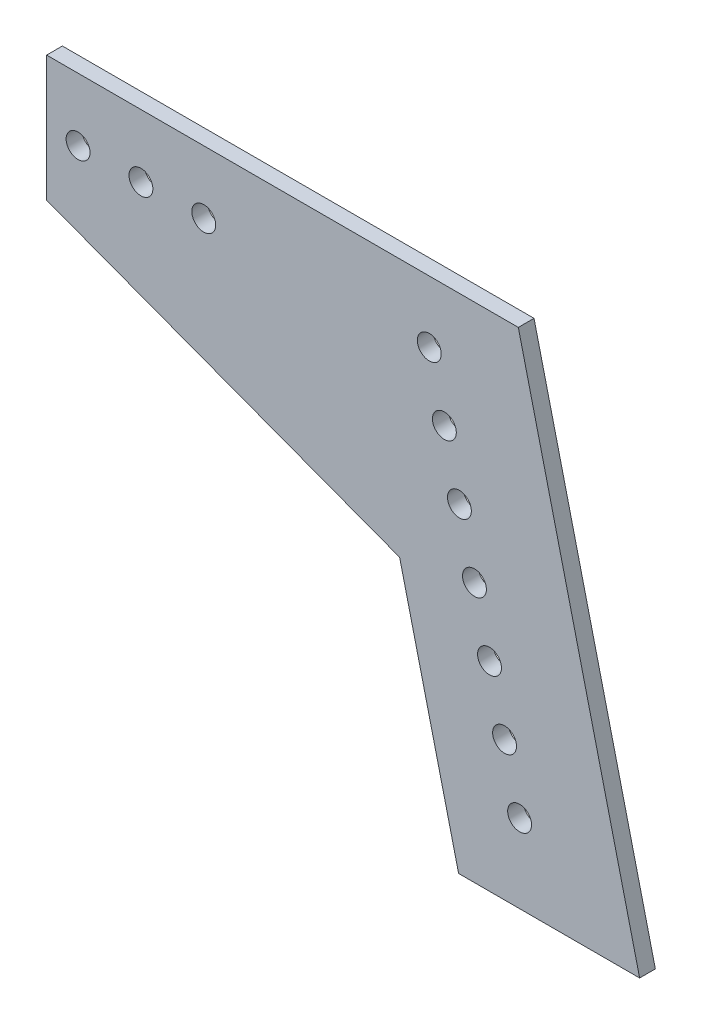
ISO-10303-21;
HEADER;
FILE_DESCRIPTION(('STEP AP214'),'2;1');
FILE_NAME('part.step','',(''),(''),'','','');
FILE_SCHEMA(('AUTOMOTIVE_DESIGN { 1 0 10303 214 1 1 1 1 }'));
ENDSEC;
DATA;
#1=APPLICATION_CONTEXT('core data for automotive mechanical design processes');
#2=APPLICATION_PROTOCOL_DEFINITION('international standard','automotive_design',2000,#1);
#3=PRODUCT_CONTEXT('',#1,'mechanical');
#4=PRODUCT('Part','Part','',(#3));
#5=PRODUCT_RELATED_PRODUCT_CATEGORY('part','',(#4));
#6=PRODUCT_DEFINITION_FORMATION('','',#4);
#7=PRODUCT_DEFINITION_CONTEXT('part definition',#1,'design');
#8=PRODUCT_DEFINITION('design','',#6,#7);
#9=PRODUCT_DEFINITION_SHAPE('','',#8);
#10=(LENGTH_UNIT() NAMED_UNIT(*) SI_UNIT(.MILLI.,.METRE.));
#11=(NAMED_UNIT(*) PLANE_ANGLE_UNIT() SI_UNIT($,.RADIAN.));
#12=(NAMED_UNIT(*) SI_UNIT($,.STERADIAN.) SOLID_ANGLE_UNIT());
#13=UNCERTAINTY_MEASURE_WITH_UNIT(LENGTH_MEASURE(1.E-05),#10,'distance_accuracy_value','');
#14=(GEOMETRIC_REPRESENTATION_CONTEXT(3) GLOBAL_UNCERTAINTY_ASSIGNED_CONTEXT((#13)) GLOBAL_UNIT_ASSIGNED_CONTEXT((#10,
#11,#12)) REPRESENTATION_CONTEXT('',''));
#15=CARTESIAN_POINT('',(0.,0.,0.));
#16=DIRECTION('',(0.,0.,1.));
#17=DIRECTION('',(1.,0.,0.));
#18=AXIS2_PLACEMENT_3D('',#15,#16,#17);
#19=CARTESIAN_POINT('',(-178.375641572512,-63.5,3.175));
#20=DIRECTION('',(0.,1.,0.));
#21=DIRECTION('',(-1.,0.,0.));
#22=AXIS2_PLACEMENT_3D('',#19,#20,#21);
#23=PLANE('',#22);
#24=DIRECTION('',(1.,0.,0.));
#25=VECTOR('',#24,1.);
#26=CARTESIAN_POINT('',(-178.375641572512,-63.5,3.175));
#27=LINE('',#26,#25);
#28=CARTESIAN_POINT('',(139.864527637599,-63.5,3.175));
#29=VERTEX_POINT('',#28);
#30=CARTESIAN_POINT('',(176.445152697022,-63.5,3.175));
#31=VERTEX_POINT('',#30);
#32=EDGE_CURVE('E204',#29,#31,#27,.T.);
#33=ORIENTED_EDGE('',*,*,#32,.F.);
#34=DIRECTION('',(0.,0.,-1.));
#35=VECTOR('',#34,1.);
#36=CARTESIAN_POINT('',(139.864527637599,-63.5,3.175));
#37=LINE('',#36,#35);
#38=CARTESIAN_POINT('',(139.864527637599,-63.5,0.));
#39=VERTEX_POINT('',#38);
#40=EDGE_CURVE('E197',#29,#39,#37,.T.);
#41=ORIENTED_EDGE('',*,*,#40,.T.);
#42=DIRECTION('',(1.,0.,0.));
#43=VECTOR('',#42,1.);
#44=CARTESIAN_POINT('',(-178.375641572512,-63.5,0.));
#45=LINE('',#44,#43);
#46=CARTESIAN_POINT('',(176.445152697022,-63.5,0.));
#47=VERTEX_POINT('',#46);
#48=EDGE_CURVE('E201',#39,#47,#45,.T.);
#49=ORIENTED_EDGE('',*,*,#48,.T.);
#50=DIRECTION('',(0.,0.,-1.));
#51=VECTOR('',#50,1.);
#52=CARTESIAN_POINT('',(176.445152697022,-63.5,3.175));
#53=LINE('',#52,#51);
#54=EDGE_CURVE('E207',#31,#47,#53,.T.);
#55=ORIENTED_EDGE('',*,*,#54,.F.);
#56=EDGE_LOOP('',(#33,#41,#49,#55));
#57=FACE_BOUND('',#56,.T.);
#58=ADVANCED_FACE('F38',(#57),#23,.F.);
#59=CARTESIAN_POINT('',(0.,0.,3.175));
#60=DIRECTION('',(0.,0.,-1.));
#61=DIRECTION('',(-1.,0.,0.));
#62=AXIS2_PLACEMENT_3D('',#59,#60,#61);
#63=PLANE('',#62);
#64=CARTESIAN_POINT('',(62.970358568024,25.3999999999997,3.175));
#65=DIRECTION('',(0.,0.,-1.));
#66=DIRECTION('',(-1.,0.,0.));
#67=AXIS2_PLACEMENT_3D('',#64,#65,#66);
#68=CIRCLE('',#67,2.413);
#69=CARTESIAN_POINT('',(60.557358568024,25.3999999999997,3.175));
#70=VERTEX_POINT('',#69);
#71=EDGE_CURVE('E123',#70,#70,#68,.T.);
#72=ORIENTED_EDGE('',*,*,#71,.T.);
#73=EDGE_LOOP('',(#72));
#74=FACE_BOUND('',#73,.T.);
#75=CARTESIAN_POINT('',(75.670358568024,25.3999999999997,3.175));
#76=DIRECTION('',(0.,0.,-1.));
#77=DIRECTION('',(-1.,0.,0.));
#78=AXIS2_PLACEMENT_3D('',#75,#76,#77);
#79=CIRCLE('',#78,2.413);
#80=CARTESIAN_POINT('',(73.257358568024,25.3999999999997,3.175));
#81=VERTEX_POINT('',#80);
#82=EDGE_CURVE('E265',#81,#81,#79,.T.);
#83=ORIENTED_EDGE('',*,*,#82,.T.);
#84=EDGE_LOOP('',(#83));
#85=FACE_BOUND('',#84,.T.);
#86=CARTESIAN_POINT('',(88.370358568024,25.3999999999997,3.175));
#87=DIRECTION('',(0.,0.,-1.));
#88=DIRECTION('',(-1.,0.,0.));
#89=AXIS2_PLACEMENT_3D('',#86,#87,#88);
#90=CIRCLE('',#89,2.413);
#91=CARTESIAN_POINT('',(85.957358568024,25.3999999999997,3.175));
#92=VERTEX_POINT('',#91);
#93=EDGE_CURVE('E259',#92,#92,#90,.T.);
#94=ORIENTED_EDGE('',*,*,#93,.T.);
#95=EDGE_LOOP('',(#94));
#96=FACE_BOUND('',#95,.T.);
#97=CARTESIAN_POINT('',(152.192493977256,-47.625,3.175));
#98=DIRECTION('',(0.,0.,-1.));
#99=DIRECTION('',(-1.,0.,0.));
#100=AXIS2_PLACEMENT_3D('',#97,#98,#99);
#101=CIRCLE('',#100,2.41299999999999);
#102=CARTESIAN_POINT('',(149.779493977256,-47.625,3.175));
#103=VERTEX_POINT('',#102);
#104=EDGE_CURVE('E136',#103,#103,#101,.T.);
#105=ORIENTED_EDGE('',*,*,#104,.T.);
#106=EDGE_LOOP('',(#105));
#107=FACE_BOUND('',#106,.T.);
#108=CARTESIAN_POINT('',(149.151314542085,-35.4142659866635,3.175));
#109=DIRECTION('',(0.,0.,-1.));
#110=DIRECTION('',(-1.,0.,0.));
#111=AXIS2_PLACEMENT_3D('',#108,#109,#110);
#112=CIRCLE('',#111,2.41299999999999);
#113=CARTESIAN_POINT('',(146.738314542085,-35.4142659866635,3.175));
#114=VERTEX_POINT('',#113);
#115=EDGE_CURVE('E145',#114,#114,#112,.T.);
#116=ORIENTED_EDGE('',*,*,#115,.T.);
#117=EDGE_LOOP('',(#116));
#118=FACE_BOUND('',#117,.T.);
#119=CARTESIAN_POINT('',(146.110135106914,-23.2035319733271,3.175));
#120=DIRECTION('',(0.,0.,-1.));
#121=DIRECTION('',(-1.,0.,0.));
#122=AXIS2_PLACEMENT_3D('',#119,#120,#121);
#123=CIRCLE('',#122,2.413);
#124=CARTESIAN_POINT('',(143.697135106914,-23.2035319733271,3.175));
#125=VERTEX_POINT('',#124);
#126=EDGE_CURVE('E153',#125,#125,#123,.T.);
#127=ORIENTED_EDGE('',*,*,#126,.T.);
#128=EDGE_LOOP('',(#127));
#129=FACE_BOUND('',#128,.T.);
#130=CARTESIAN_POINT('',(143.068955671742,-10.9927979599906,3.175));
#131=DIRECTION('',(0.,0.,-1.));
#132=DIRECTION('',(-1.,0.,0.));
#133=AXIS2_PLACEMENT_3D('',#130,#131,#132);
#134=CIRCLE('',#133,2.41299999999999);
#135=CARTESIAN_POINT('',(140.655955671742,-10.9927979599906,3.175));
#136=VERTEX_POINT('',#135);
#137=EDGE_CURVE('E161',#136,#136,#134,.T.);
#138=ORIENTED_EDGE('',*,*,#137,.T.);
#139=EDGE_LOOP('',(#138));
#140=FACE_BOUND('',#139,.T.);
#141=CARTESIAN_POINT('',(140.027776236571,1.2179360533458,3.175));
#142=DIRECTION('',(0.,0.,-1.));
#143=DIRECTION('',(-1.,0.,0.));
#144=AXIS2_PLACEMENT_3D('',#141,#142,#143);
#145=CIRCLE('',#144,2.413);
#146=CARTESIAN_POINT('',(137.614776236571,1.2179360533458,3.175));
#147=VERTEX_POINT('',#146);
#148=EDGE_CURVE('E169',#147,#147,#145,.T.);
#149=ORIENTED_EDGE('',*,*,#148,.T.);
#150=EDGE_LOOP('',(#149));
#151=FACE_BOUND('',#150,.T.);
#152=CARTESIAN_POINT('',(136.9865968014,13.4286700666822,3.175));
#153=DIRECTION('',(0.,0.,-1.));
#154=DIRECTION('',(-1.,0.,0.));
#155=AXIS2_PLACEMENT_3D('',#152,#153,#154);
#156=CIRCLE('',#155,2.41299999999999);
#157=CARTESIAN_POINT('',(134.5735968014,13.4286700666822,3.175));
#158=VERTEX_POINT('',#157);
#159=EDGE_CURVE('E177',#158,#158,#156,.T.);
#160=ORIENTED_EDGE('',*,*,#159,.T.);
#161=EDGE_LOOP('',(#160));
#162=FACE_BOUND('',#161,.T.);
#163=CARTESIAN_POINT('',(133.945417366229,25.6394040800187,3.175));
#164=DIRECTION('',(0.,0.,-1.));
#165=DIRECTION('',(-1.,0.,0.));
#166=AXIS2_PLACEMENT_3D('',#163,#164,#165);
#167=CIRCLE('',#166,2.413);
#168=CARTESIAN_POINT('',(131.532417366229,25.6394040800187,3.175));
#169=VERTEX_POINT('',#168);
#170=EDGE_CURVE('E185',#169,#169,#167,.T.);
#171=ORIENTED_EDGE('',*,*,#170,.T.);
#172=EDGE_LOOP('',(#171));
#173=FACE_BOUND('',#172,.T.);
#174=DIRECTION('',(0.,-1.,0.));
#175=VECTOR('',#174,1.);
#176=CARTESIAN_POINT('',(56.620358568024,12.7,3.175));
#177=LINE('',#176,#175);
#178=CARTESIAN_POINT('',(56.620358568024,38.1,3.175));
#179=VERTEX_POINT('',#178);
#180=CARTESIAN_POINT('',(56.620358568024,12.7,3.175));
#181=VERTEX_POINT('',#180);
#182=EDGE_CURVE('E54',#179,#181,#177,.T.);
#183=ORIENTED_EDGE('',*,*,#182,.T.);
#184=DIRECTION('',(0.936021054773888,-0.351944008359252,0.));
#185=VECTOR('',#184,1.);
#186=CARTESIAN_POINT('',(127.945162941794,-14.118133436975,3.175));
#187=LINE('',#186,#185);
#188=CARTESIAN_POINT('',(127.945162941794,-14.118133436975,3.175));
#189=VERTEX_POINT('',#188);
#190=EDGE_CURVE('E102',#181,#189,#187,.T.);
#191=ORIENTED_EDGE('',*,*,#190,.T.);
#192=DIRECTION('',(0.234633163303243,-0.972083987461121,0.));
#193=VECTOR('',#192,1.);
#194=CARTESIAN_POINT('',(139.864527637599,-63.5,3.175));
#195=LINE('',#194,#193);
#196=EDGE_CURVE('E192',#189,#29,#195,.T.);
#197=ORIENTED_EDGE('',*,*,#196,.T.);
#198=ORIENTED_EDGE('',*,*,#32,.T.);
#199=DIRECTION('',(-0.234569716009801,0.972099299624828,0.));
#200=VECTOR('',#199,1.);
#201=CARTESIAN_POINT('',(139.670694847201,88.9,3.175));
#202=LINE('',#201,#200);
#203=CARTESIAN_POINT('',(151.928847463808,38.1,3.175));
#204=VERTEX_POINT('',#203);
#205=EDGE_CURVE('E47',#31,#204,#202,.T.);
#206=ORIENTED_EDGE('',*,*,#205,.T.);
#207=DIRECTION('',(-1.,0.,0.));
#208=VECTOR('',#207,1.);
#209=CARTESIAN_POINT('',(151.928847463808,38.1,3.175));
#210=LINE('',#209,#208);
#211=EDGE_CURVE('E61',#204,#179,#210,.T.);
#212=ORIENTED_EDGE('',*,*,#211,.T.);
#213=EDGE_LOOP('',(#183,#191,#197,#198,#206,#212));
#214=FACE_BOUND('',#213,.T.);
#215=ADVANCED_FACE('F111',(#74,#85,#96,#107,#118,#129,#140,#151,#162,#173,#214),#63,.F.);
#216=CARTESIAN_POINT('',(0.,0.,0.));
#217=DIRECTION('',(0.,0.,-1.));
#218=DIRECTION('',(-1.,0.,0.));
#219=AXIS2_PLACEMENT_3D('',#216,#217,#218);
#220=PLANE('',#219);
#221=CARTESIAN_POINT('',(62.970358568024,25.3999999999997,0.));
#222=DIRECTION('',(0.,0.,-1.));
#223=DIRECTION('',(-1.,0.,0.));
#224=AXIS2_PLACEMENT_3D('',#221,#222,#223);
#225=CIRCLE('',#224,2.413);
#226=CARTESIAN_POINT('',(60.557358568024,25.3999999999997,0.));
#227=VERTEX_POINT('',#226);
#228=EDGE_CURVE('E250',#227,#227,#225,.T.);
#229=ORIENTED_EDGE('',*,*,#228,.F.);
#230=EDGE_LOOP('',(#229));
#231=FACE_BOUND('',#230,.T.);
#232=CARTESIAN_POINT('',(75.670358568024,25.3999999999997,0.));
#233=DIRECTION('',(0.,0.,-1.));
#234=DIRECTION('',(-1.,0.,0.));
#235=AXIS2_PLACEMENT_3D('',#232,#233,#234);
#236=CIRCLE('',#235,2.413);
#237=CARTESIAN_POINT('',(73.257358568024,25.3999999999997,0.));
#238=VERTEX_POINT('',#237);
#239=EDGE_CURVE('E254',#238,#238,#236,.T.);
#240=ORIENTED_EDGE('',*,*,#239,.F.);
#241=EDGE_LOOP('',(#240));
#242=FACE_BOUND('',#241,.T.);
#243=CARTESIAN_POINT('',(88.370358568024,25.3999999999997,0.));
#244=DIRECTION('',(0.,0.,-1.));
#245=DIRECTION('',(-1.,0.,0.));
#246=AXIS2_PLACEMENT_3D('',#243,#244,#245);
#247=CIRCLE('',#246,2.413);
#248=CARTESIAN_POINT('',(85.957358568024,25.3999999999997,0.));
#249=VERTEX_POINT('',#248);
#250=EDGE_CURVE('E119',#249,#249,#247,.T.);
#251=ORIENTED_EDGE('',*,*,#250,.F.);
#252=EDGE_LOOP('',(#251));
#253=FACE_BOUND('',#252,.T.);
#254=DIRECTION('',(0.936021054773888,-0.351944008359252,0.));
#255=VECTOR('',#254,1.);
#256=CARTESIAN_POINT('',(127.945162941794,-14.118133436975,0.));
#257=LINE('',#256,#255);
#258=CARTESIAN_POINT('',(56.620358568024,12.7,0.));
#259=VERTEX_POINT('',#258);
#260=CARTESIAN_POINT('',(127.945162941794,-14.118133436975,0.));
#261=VERTEX_POINT('',#260);
#262=EDGE_CURVE('E114',#259,#261,#257,.T.);
#263=ORIENTED_EDGE('',*,*,#262,.F.);
#264=DIRECTION('',(0.,-1.,0.));
#265=VECTOR('',#264,1.);
#266=CARTESIAN_POINT('',(56.620358568024,12.7,0.));
#267=LINE('',#266,#265);
#268=CARTESIAN_POINT('',(56.620358568024,38.1,0.));
#269=VERTEX_POINT('',#268);
#270=EDGE_CURVE('E94',#269,#259,#267,.T.);
#271=ORIENTED_EDGE('',*,*,#270,.F.);
#272=DIRECTION('',(-1.,0.,0.));
#273=VECTOR('',#272,1.);
#274=CARTESIAN_POINT('',(151.928847463808,38.1,0.));
#275=LINE('',#274,#273);
#276=CARTESIAN_POINT('',(151.928847463808,38.1,0.));
#277=VERTEX_POINT('',#276);
#278=EDGE_CURVE('E98',#277,#269,#275,.T.);
#279=ORIENTED_EDGE('',*,*,#278,.F.);
#280=DIRECTION('',(-0.234569716009801,0.972099299624828,0.));
#281=VECTOR('',#280,1.);
#282=CARTESIAN_POINT('',(152.257028490917,36.7399585077311,0.));
#283=LINE('',#282,#281);
#284=EDGE_CURVE('E11',#47,#277,#283,.T.);
#285=ORIENTED_EDGE('',*,*,#284,.F.);
#286=ORIENTED_EDGE('',*,*,#48,.F.);
#287=DIRECTION('',(0.234633163303243,-0.972083987461121,0.));
#288=VECTOR('',#287,1.);
#289=CARTESIAN_POINT('',(139.864527637599,-63.5,0.));
#290=LINE('',#289,#288);
#291=EDGE_CURVE('E140',#261,#39,#290,.T.);
#292=ORIENTED_EDGE('',*,*,#291,.F.);
#293=EDGE_LOOP('',(#263,#271,#279,#285,#286,#292));
#294=FACE_BOUND('',#293,.T.);
#295=CARTESIAN_POINT('',(152.192493977256,-47.625,0.));
#296=DIRECTION('',(0.,0.,-1.));
#297=DIRECTION('',(-1.,0.,0.));
#298=AXIS2_PLACEMENT_3D('',#295,#296,#297);
#299=CIRCLE('',#298,2.41299999999999);
#300=CARTESIAN_POINT('',(149.779493977256,-47.625,0.));
#301=VERTEX_POINT('',#300);
#302=EDGE_CURVE('E141',#301,#301,#299,.T.);
#303=ORIENTED_EDGE('',*,*,#302,.F.);
#304=EDGE_LOOP('',(#303));
#305=FACE_BOUND('',#304,.T.);
#306=CARTESIAN_POINT('',(149.151314542085,-35.4142659866635,0.));
#307=DIRECTION('',(0.,0.,-1.));
#308=DIRECTION('',(-1.,0.,0.));
#309=AXIS2_PLACEMENT_3D('',#306,#307,#308);
#310=CIRCLE('',#309,2.41299999999999);
#311=CARTESIAN_POINT('',(146.738314542085,-35.4142659866635,0.));
#312=VERTEX_POINT('',#311);
#313=EDGE_CURVE('E149',#312,#312,#310,.T.);
#314=ORIENTED_EDGE('',*,*,#313,.F.);
#315=EDGE_LOOP('',(#314));
#316=FACE_BOUND('',#315,.T.);
#317=CARTESIAN_POINT('',(146.110135106914,-23.2035319733271,0.));
#318=DIRECTION('',(0.,0.,-1.));
#319=DIRECTION('',(-1.,0.,0.));
#320=AXIS2_PLACEMENT_3D('',#317,#318,#319);
#321=CIRCLE('',#320,2.413);
#322=CARTESIAN_POINT('',(143.697135106914,-23.2035319733271,0.));
#323=VERTEX_POINT('',#322);
#324=EDGE_CURVE('E157',#323,#323,#321,.T.);
#325=ORIENTED_EDGE('',*,*,#324,.F.);
#326=EDGE_LOOP('',(#325));
#327=FACE_BOUND('',#326,.T.);
#328=CARTESIAN_POINT('',(143.068955671742,-10.9927979599906,0.));
#329=DIRECTION('',(0.,0.,-1.));
#330=DIRECTION('',(-1.,0.,0.));
#331=AXIS2_PLACEMENT_3D('',#328,#329,#330);
#332=CIRCLE('',#331,2.41299999999999);
#333=CARTESIAN_POINT('',(140.655955671742,-10.9927979599906,0.));
#334=VERTEX_POINT('',#333);
#335=EDGE_CURVE('E165',#334,#334,#332,.T.);
#336=ORIENTED_EDGE('',*,*,#335,.F.);
#337=EDGE_LOOP('',(#336));
#338=FACE_BOUND('',#337,.T.);
#339=CARTESIAN_POINT('',(140.027776236571,1.2179360533458,0.));
#340=DIRECTION('',(0.,0.,-1.));
#341=DIRECTION('',(-1.,0.,0.));
#342=AXIS2_PLACEMENT_3D('',#339,#340,#341);
#343=CIRCLE('',#342,2.413);
#344=CARTESIAN_POINT('',(137.614776236571,1.2179360533458,0.));
#345=VERTEX_POINT('',#344);
#346=EDGE_CURVE('E173',#345,#345,#343,.T.);
#347=ORIENTED_EDGE('',*,*,#346,.F.);
#348=EDGE_LOOP('',(#347));
#349=FACE_BOUND('',#348,.T.);
#350=CARTESIAN_POINT('',(136.9865968014,13.4286700666822,0.));
#351=DIRECTION('',(0.,0.,-1.));
#352=DIRECTION('',(-1.,0.,0.));
#353=AXIS2_PLACEMENT_3D('',#350,#351,#352);
#354=CIRCLE('',#353,2.41299999999999);
#355=CARTESIAN_POINT('',(134.5735968014,13.4286700666822,0.));
#356=VERTEX_POINT('',#355);
#357=EDGE_CURVE('E181',#356,#356,#354,.T.);
#358=ORIENTED_EDGE('',*,*,#357,.F.);
#359=EDGE_LOOP('',(#358));
#360=FACE_BOUND('',#359,.T.);
#361=CARTESIAN_POINT('',(133.945417366229,25.6394040800187,0.));
#362=DIRECTION('',(0.,0.,-1.));
#363=DIRECTION('',(-1.,0.,0.));
#364=AXIS2_PLACEMENT_3D('',#361,#362,#363);
#365=CIRCLE('',#364,2.413);
#366=CARTESIAN_POINT('',(131.532417366229,25.6394040800187,0.));
#367=VERTEX_POINT('',#366);
#368=EDGE_CURVE('E135',#367,#367,#365,.T.);
#369=ORIENTED_EDGE('',*,*,#368,.F.);
#370=EDGE_LOOP('',(#369));
#371=FACE_BOUND('',#370,.T.);
#372=ADVANCED_FACE('F40',(#231,#242,#253,#294,#305,#316,#327,#338,#349,#360,#371),#220,.T.);
#373=CARTESIAN_POINT('',(139.670694847201,88.9,3.175));
#374=DIRECTION('',(-0.972099299624828,-0.234569716009801,0.));
#375=DIRECTION('',(0.234569716009801,-0.972099299624828,0.));
#376=AXIS2_PLACEMENT_3D('',#373,#374,#375);
#377=PLANE('',#376);
#378=ORIENTED_EDGE('',*,*,#284,.T.);
#379=DIRECTION('',(0.,0.,-1.));
#380=VECTOR('',#379,1.);
#381=CARTESIAN_POINT('',(151.928847463808,38.1,3.175));
#382=LINE('',#381,#380);
#383=EDGE_CURVE('E129',#204,#277,#382,.T.);
#384=ORIENTED_EDGE('',*,*,#383,.F.);
#385=ORIENTED_EDGE('',*,*,#205,.F.);
#386=ORIENTED_EDGE('',*,*,#54,.T.);
#387=EDGE_LOOP('',(#378,#384,#385,#386));
#388=FACE_BOUND('',#387,.T.);
#389=ADVANCED_FACE('F217',(#388),#377,.F.);
#390=CARTESIAN_POINT('',(139.864527637599,-63.5,3.175));
#391=DIRECTION('',(0.972083987461121,0.234633163303243,0.));
#392=DIRECTION('',(-0.234633163303243,0.972083987461121,0.));
#393=AXIS2_PLACEMENT_3D('',#390,#391,#392);
#394=PLANE('',#393);
#395=ORIENTED_EDGE('',*,*,#291,.T.);
#396=ORIENTED_EDGE('',*,*,#40,.F.);
#397=ORIENTED_EDGE('',*,*,#196,.F.);
#398=DIRECTION('',(0.,0.,-1.));
#399=VECTOR('',#398,1.);
#400=CARTESIAN_POINT('',(127.945162941794,-14.118133436975,3.175));
#401=LINE('',#400,#399);
#402=EDGE_CURVE('E105',#189,#261,#401,.T.);
#403=ORIENTED_EDGE('',*,*,#402,.T.);
#404=EDGE_LOOP('',(#395,#396,#397,#403));
#405=FACE_BOUND('',#404,.T.);
#406=ADVANCED_FACE('F226',(#405),#394,.F.);
#407=CARTESIAN_POINT('',(133.945417366229,25.6394040800187,3.175));
#408=DIRECTION('',(0.,0.,-1.));
#409=DIRECTION('',(-1.,0.,0.));
#410=AXIS2_PLACEMENT_3D('',#407,#408,#409);
#411=CYLINDRICAL_SURFACE('',#410,2.413);
#412=ORIENTED_EDGE('',*,*,#170,.F.);
#413=EDGE_LOOP('',(#412));
#414=FACE_BOUND('',#413,.T.);
#415=ORIENTED_EDGE('',*,*,#368,.T.);
#416=EDGE_LOOP('',(#415));
#417=FACE_BOUND('',#416,.T.);
#418=ADVANCED_FACE('F242',(#414,#417),#411,.F.);
#419=CARTESIAN_POINT('',(136.9865968014,13.4286700666822,3.175));
#420=DIRECTION('',(0.,0.,-1.));
#421=DIRECTION('',(-1.,0.,0.));
#422=AXIS2_PLACEMENT_3D('',#419,#420,#421);
#423=CYLINDRICAL_SURFACE('',#422,2.41299999999999);
#424=ORIENTED_EDGE('',*,*,#159,.F.);
#425=EDGE_LOOP('',(#424));
#426=FACE_BOUND('',#425,.T.);
#427=ORIENTED_EDGE('',*,*,#357,.T.);
#428=EDGE_LOOP('',(#427));
#429=FACE_BOUND('',#428,.T.);
#430=ADVANCED_FACE('F318',(#426,#429),#423,.F.);
#431=CARTESIAN_POINT('',(140.027776236571,1.2179360533458,3.175));
#432=DIRECTION('',(0.,0.,-1.));
#433=DIRECTION('',(-1.,0.,0.));
#434=AXIS2_PLACEMENT_3D('',#431,#432,#433);
#435=CYLINDRICAL_SURFACE('',#434,2.413);
#436=ORIENTED_EDGE('',*,*,#148,.F.);
#437=EDGE_LOOP('',(#436));
#438=FACE_BOUND('',#437,.T.);
#439=ORIENTED_EDGE('',*,*,#346,.T.);
#440=EDGE_LOOP('',(#439));
#441=FACE_BOUND('',#440,.T.);
#442=ADVANCED_FACE('F314',(#438,#441),#435,.F.);
#443=CARTESIAN_POINT('',(143.068955671742,-10.9927979599906,3.175));
#444=DIRECTION('',(0.,0.,-1.));
#445=DIRECTION('',(-1.,0.,0.));
#446=AXIS2_PLACEMENT_3D('',#443,#444,#445);
#447=CYLINDRICAL_SURFACE('',#446,2.41299999999999);
#448=ORIENTED_EDGE('',*,*,#137,.F.);
#449=EDGE_LOOP('',(#448));
#450=FACE_BOUND('',#449,.T.);
#451=ORIENTED_EDGE('',*,*,#335,.T.);
#452=EDGE_LOOP('',(#451));
#453=FACE_BOUND('',#452,.T.);
#454=ADVANCED_FACE('F310',(#450,#453),#447,.F.);
#455=CARTESIAN_POINT('',(146.110135106914,-23.2035319733271,3.175));
#456=DIRECTION('',(0.,0.,-1.));
#457=DIRECTION('',(-1.,0.,0.));
#458=AXIS2_PLACEMENT_3D('',#455,#456,#457);
#459=CYLINDRICAL_SURFACE('',#458,2.413);
#460=ORIENTED_EDGE('',*,*,#126,.F.);
#461=EDGE_LOOP('',(#460));
#462=FACE_BOUND('',#461,.T.);
#463=ORIENTED_EDGE('',*,*,#324,.T.);
#464=EDGE_LOOP('',(#463));
#465=FACE_BOUND('',#464,.T.);
#466=ADVANCED_FACE('F306',(#462,#465),#459,.F.);
#467=CARTESIAN_POINT('',(149.151314542085,-35.4142659866635,3.175));
#468=DIRECTION('',(0.,0.,-1.));
#469=DIRECTION('',(-1.,0.,0.));
#470=AXIS2_PLACEMENT_3D('',#467,#468,#469);
#471=CYLINDRICAL_SURFACE('',#470,2.41299999999999);
#472=ORIENTED_EDGE('',*,*,#115,.F.);
#473=EDGE_LOOP('',(#472));
#474=FACE_BOUND('',#473,.T.);
#475=ORIENTED_EDGE('',*,*,#313,.T.);
#476=EDGE_LOOP('',(#475));
#477=FACE_BOUND('',#476,.T.);
#478=ADVANCED_FACE('F302',(#474,#477),#471,.F.);
#479=CARTESIAN_POINT('',(152.192493977256,-47.625,3.175));
#480=DIRECTION('',(0.,0.,-1.));
#481=DIRECTION('',(-1.,0.,0.));
#482=AXIS2_PLACEMENT_3D('',#479,#480,#481);
#483=CYLINDRICAL_SURFACE('',#482,2.41299999999999);
#484=ORIENTED_EDGE('',*,*,#104,.F.);
#485=EDGE_LOOP('',(#484));
#486=FACE_BOUND('',#485,.T.);
#487=ORIENTED_EDGE('',*,*,#302,.T.);
#488=EDGE_LOOP('',(#487));
#489=FACE_BOUND('',#488,.T.);
#490=ADVANCED_FACE('F299',(#486,#489),#483,.F.);
#491=CARTESIAN_POINT('',(151.928847463808,38.1,3.175));
#492=DIRECTION('',(0.,-1.,0.));
#493=DIRECTION('',(0.,0.,-1.));
#494=AXIS2_PLACEMENT_3D('',#491,#492,#493);
#495=PLANE('',#494);
#496=ORIENTED_EDGE('',*,*,#278,.T.);
#497=DIRECTION('',(0.,0.,-1.));
#498=VECTOR('',#497,1.);
#499=CARTESIAN_POINT('',(56.620358568024,38.1,3.175));
#500=LINE('',#499,#498);
#501=EDGE_CURVE('E99',#179,#269,#500,.T.);
#502=ORIENTED_EDGE('',*,*,#501,.F.);
#503=ORIENTED_EDGE('',*,*,#211,.F.);
#504=ORIENTED_EDGE('',*,*,#383,.T.);
#505=EDGE_LOOP('',(#496,#502,#503,#504));
#506=FACE_BOUND('',#505,.T.);
#507=ADVANCED_FACE('F220',(#506),#495,.F.);
#508=CARTESIAN_POINT('',(127.945162941794,-14.118133436975,3.175));
#509=DIRECTION('',(0.351944008359252,0.936021054773888,0.));
#510=DIRECTION('',(-0.936021054773889,0.351944008359252,0.));
#511=AXIS2_PLACEMENT_3D('',#508,#509,#510);
#512=PLANE('',#511);
#513=ORIENTED_EDGE('',*,*,#262,.T.);
#514=ORIENTED_EDGE('',*,*,#402,.F.);
#515=ORIENTED_EDGE('',*,*,#190,.F.);
#516=DIRECTION('',(0.,0.,-1.));
#517=VECTOR('',#516,1.);
#518=CARTESIAN_POINT('',(56.620358568024,12.7,3.175));
#519=LINE('',#518,#517);
#520=EDGE_CURVE('E90',#181,#259,#519,.T.);
#521=ORIENTED_EDGE('',*,*,#520,.T.);
#522=EDGE_LOOP('',(#513,#514,#515,#521));
#523=FACE_BOUND('',#522,.T.);
#524=ADVANCED_FACE('F103',(#523),#512,.F.);
#525=CARTESIAN_POINT('',(56.620358568024,12.7,3.175));
#526=DIRECTION('',(1.,0.,0.));
#527=DIRECTION('',(0.,0.,-1.));
#528=AXIS2_PLACEMENT_3D('',#525,#526,#527);
#529=PLANE('',#528);
#530=ORIENTED_EDGE('',*,*,#270,.T.);
#531=ORIENTED_EDGE('',*,*,#520,.F.);
#532=ORIENTED_EDGE('',*,*,#182,.F.);
#533=ORIENTED_EDGE('',*,*,#501,.T.);
#534=EDGE_LOOP('',(#530,#531,#532,#533));
#535=FACE_BOUND('',#534,.T.);
#536=ADVANCED_FACE('F92',(#535),#529,.F.);
#537=CARTESIAN_POINT('',(88.370358568024,25.3999999999997,3.175));
#538=DIRECTION('',(0.,0.,-1.));
#539=DIRECTION('',(-1.,0.,0.));
#540=AXIS2_PLACEMENT_3D('',#537,#538,#539);
#541=CYLINDRICAL_SURFACE('',#540,2.413);
#542=ORIENTED_EDGE('',*,*,#93,.F.);
#543=EDGE_LOOP('',(#542));
#544=FACE_BOUND('',#543,.T.);
#545=ORIENTED_EDGE('',*,*,#250,.T.);
#546=EDGE_LOOP('',(#545));
#547=FACE_BOUND('',#546,.T.);
#548=ADVANCED_FACE('F286',(#544,#547),#541,.F.);
#549=CARTESIAN_POINT('',(75.670358568024,25.3999999999997,3.175));
#550=DIRECTION('',(0.,0.,-1.));
#551=DIRECTION('',(-1.,0.,0.));
#552=AXIS2_PLACEMENT_3D('',#549,#550,#551);
#553=CYLINDRICAL_SURFACE('',#552,2.413);
#554=ORIENTED_EDGE('',*,*,#82,.F.);
#555=EDGE_LOOP('',(#554));
#556=FACE_BOUND('',#555,.T.);
#557=ORIENTED_EDGE('',*,*,#239,.T.);
#558=EDGE_LOOP('',(#557));
#559=FACE_BOUND('',#558,.T.);
#560=ADVANCED_FACE('F281',(#556,#559),#553,.F.);
#561=CARTESIAN_POINT('',(62.970358568024,25.3999999999997,3.175));
#562=DIRECTION('',(0.,0.,-1.));
#563=DIRECTION('',(-1.,0.,0.));
#564=AXIS2_PLACEMENT_3D('',#561,#562,#563);
#565=CYLINDRICAL_SURFACE('',#564,2.413);
#566=ORIENTED_EDGE('',*,*,#71,.F.);
#567=EDGE_LOOP('',(#566));
#568=FACE_BOUND('',#567,.T.);
#569=ORIENTED_EDGE('',*,*,#228,.T.);
#570=EDGE_LOOP('',(#569));
#571=FACE_BOUND('',#570,.T.);
#572=ADVANCED_FACE('F278',(#568,#571),#565,.F.);
#573=CLOSED_SHELL('',(#58,#215,#372,#389,#406,#418,#430,#442,#454,#466,#478,#490,#507,#524,#536,
#548,#560,#572));
#574=MANIFOLD_SOLID_BREP('B2',#573);
#575=ADVANCED_BREP_SHAPE_REPRESENTATION('',(#18,#574),#14);
#576=SHAPE_DEFINITION_REPRESENTATION(#9,#575);
ENDSEC;
END-ISO-10303-21;
